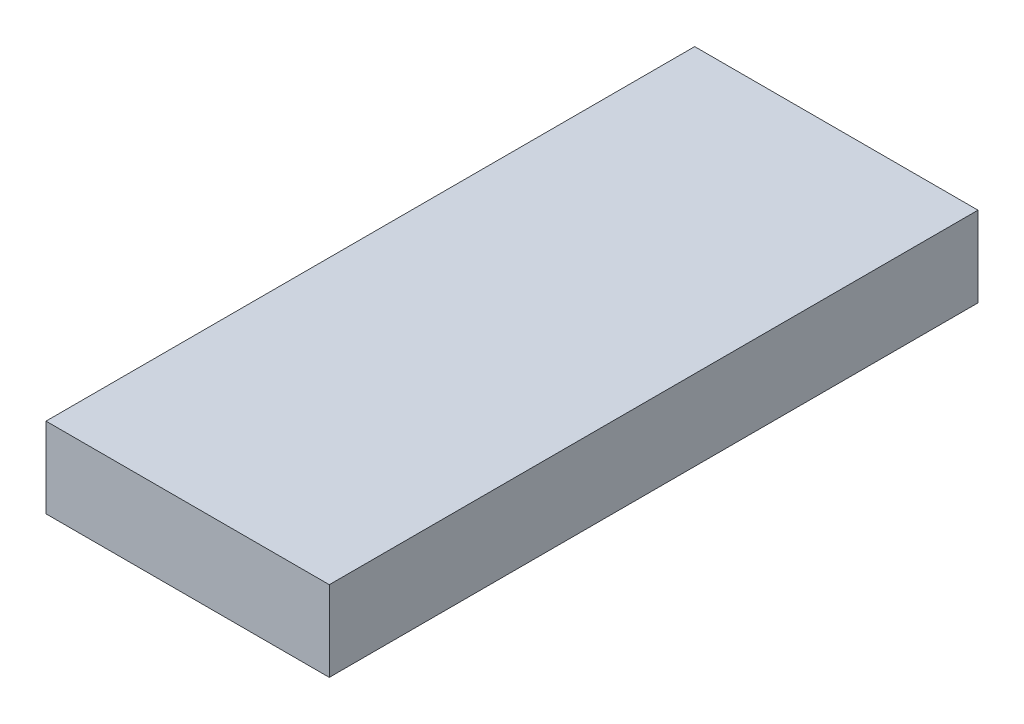
ISO-10303-21;
HEADER;
FILE_DESCRIPTION(('STEP AP214'),'2;1');
FILE_NAME('part.step','',(''),(''),'','','');
FILE_SCHEMA(('AUTOMOTIVE_DESIGN { 1 0 10303 214 1 1 1 1 }'));
ENDSEC;
DATA;
#1=APPLICATION_CONTEXT('core data for automotive mechanical design processes');
#2=APPLICATION_PROTOCOL_DEFINITION('international standard','automotive_design',2000,#1);
#3=PRODUCT_CONTEXT('',#1,'mechanical');
#4=PRODUCT('Part','Part','',(#3));
#5=PRODUCT_RELATED_PRODUCT_CATEGORY('part','',(#4));
#6=PRODUCT_DEFINITION_FORMATION('','',#4);
#7=PRODUCT_DEFINITION_CONTEXT('part definition',#1,'design');
#8=PRODUCT_DEFINITION('design','',#6,#7);
#9=PRODUCT_DEFINITION_SHAPE('','',#8);
#10=(LENGTH_UNIT() NAMED_UNIT(*) SI_UNIT(.MILLI.,.METRE.));
#11=(NAMED_UNIT(*) PLANE_ANGLE_UNIT() SI_UNIT($,.RADIAN.));
#12=(NAMED_UNIT(*) SI_UNIT($,.STERADIAN.) SOLID_ANGLE_UNIT());
#13=UNCERTAINTY_MEASURE_WITH_UNIT(LENGTH_MEASURE(1.E-05),#10,'distance_accuracy_value','');
#14=(GEOMETRIC_REPRESENTATION_CONTEXT(3) GLOBAL_UNCERTAINTY_ASSIGNED_CONTEXT((#13)) GLOBAL_UNIT_ASSIGNED_CONTEXT((#10,
#11,#12)) REPRESENTATION_CONTEXT('',''));
#15=CARTESIAN_POINT('',(0.,0.,0.));
#16=DIRECTION('',(0.,0.,1.));
#17=DIRECTION('',(1.,0.,0.));
#18=AXIS2_PLACEMENT_3D('',#15,#16,#17);
#19=CARTESIAN_POINT('',(0.,0.,0.));
#20=DIRECTION('',(0.,1.,0.));
#21=DIRECTION('',(0.,0.,1.));
#22=AXIS2_PLACEMENT_3D('',#19,#20,#21);
#23=PLANE('',#22);
#24=DIRECTION('',(0.,0.,-1.));
#25=VECTOR('',#24,1.);
#26=CARTESIAN_POINT('',(31.75,0.,-72.7));
#27=LINE('',#26,#25);
#28=CARTESIAN_POINT('',(31.75,0.,72.7));
#29=VERTEX_POINT('',#28);
#30=CARTESIAN_POINT('',(31.75,0.,-72.7));
#31=VERTEX_POINT('',#30);
#32=EDGE_CURVE('E158',#29,#31,#27,.T.);
#33=ORIENTED_EDGE('',*,*,#32,.F.);
#34=DIRECTION('',(1.,0.,0.));
#35=VECTOR('',#34,1.);
#36=CARTESIAN_POINT('',(-31.75,0.,72.7));
#37=LINE('',#36,#35);
#38=CARTESIAN_POINT('',(-31.75,0.,72.7));
#39=VERTEX_POINT('',#38);
#40=EDGE_CURVE('E151',#39,#29,#37,.T.);
#41=ORIENTED_EDGE('',*,*,#40,.F.);
#42=DIRECTION('',(0.,0.,1.));
#43=VECTOR('',#42,1.);
#44=CARTESIAN_POINT('',(-31.75,0.,-72.7));
#45=LINE('',#44,#43);
#46=CARTESIAN_POINT('',(-31.75,0.,-72.7));
#47=VERTEX_POINT('',#46);
#48=EDGE_CURVE('E163',#47,#39,#45,.T.);
#49=ORIENTED_EDGE('',*,*,#48,.F.);
#50=DIRECTION('',(-1.,0.,0.));
#51=VECTOR('',#50,1.);
#52=CARTESIAN_POINT('',(-31.75,0.,-72.7));
#53=LINE('',#52,#51);
#54=EDGE_CURVE('E161',#31,#47,#53,.T.);
#55=ORIENTED_EDGE('',*,*,#54,.F.);
#56=EDGE_LOOP('',(#33,#41,#49,#55));
#57=FACE_BOUND('',#56,.T.);
#58=CARTESIAN_POINT('',(10.75,0.,-36.72));
#59=DIRECTION('',(0.,1.,0.));
#60=DIRECTION('',(0.,0.,1.));
#61=AXIS2_PLACEMENT_3D('',#58,#59,#60);
#62=CIRCLE('',#61,0.75);
#63=CARTESIAN_POINT('',(10.75,0.,-35.97));
#64=VERTEX_POINT('',#63);
#65=EDGE_CURVE('E141',#64,#64,#62,.F.);
#66=ORIENTED_EDGE('',*,*,#65,.F.);
#67=EDGE_LOOP('',(#66));
#68=FACE_BOUND('',#67,.T.);
#69=CARTESIAN_POINT('',(10.75,0.,-34.18));
#70=DIRECTION('',(0.,1.,0.));
#71=DIRECTION('',(0.,0.,1.));
#72=AXIS2_PLACEMENT_3D('',#69,#70,#71);
#73=CIRCLE('',#72,0.75);
#74=CARTESIAN_POINT('',(10.75,0.,-33.43));
#75=VERTEX_POINT('',#74);
#76=EDGE_CURVE('E175',#75,#75,#73,.F.);
#77=ORIENTED_EDGE('',*,*,#76,.F.);
#78=EDGE_LOOP('',(#77));
#79=FACE_BOUND('',#78,.T.);
#80=CARTESIAN_POINT('',(10.75,0.,-31.64));
#81=DIRECTION('',(0.,1.,0.));
#82=DIRECTION('',(0.,0.,1.));
#83=AXIS2_PLACEMENT_3D('',#80,#81,#82);
#84=CIRCLE('',#83,0.75);
#85=CARTESIAN_POINT('',(10.75,0.,-30.89));
#86=VERTEX_POINT('',#85);
#87=EDGE_CURVE('E177',#86,#86,#84,.F.);
#88=ORIENTED_EDGE('',*,*,#87,.F.);
#89=EDGE_LOOP('',(#88));
#90=FACE_BOUND('',#89,.T.);
#91=CARTESIAN_POINT('',(10.75,0.,-29.1));
#92=DIRECTION('',(0.,1.,0.));
#93=DIRECTION('',(0.,0.,1.));
#94=AXIS2_PLACEMENT_3D('',#91,#92,#93);
#95=CIRCLE('',#94,0.75);
#96=CARTESIAN_POINT('',(10.75,0.,-28.35));
#97=VERTEX_POINT('',#96);
#98=EDGE_CURVE('E45',#97,#97,#95,.F.);
#99=ORIENTED_EDGE('',*,*,#98,.F.);
#100=EDGE_LOOP('',(#99));
#101=FACE_BOUND('',#100,.T.);
#102=DIRECTION('',(0.,0.,1.));
#103=VECTOR('',#102,1.);
#104=CARTESIAN_POINT('',(0.649999999999991,0.,-57.4));
#105=LINE('',#104,#103);
#106=CARTESIAN_POINT('',(0.649999999999991,0.,-63.1));
#107=VERTEX_POINT('',#106);
#108=CARTESIAN_POINT('',(0.649999999999991,0.,-57.4));
#109=VERTEX_POINT('',#108);
#110=EDGE_CURVE('E128',#107,#109,#105,.T.);
#111=ORIENTED_EDGE('',*,*,#110,.F.);
#112=DIRECTION('',(1.,0.,0.));
#113=VECTOR('',#112,1.);
#114=CARTESIAN_POINT('',(-14.35,0.,-63.1));
#115=LINE('',#114,#113);
#116=CARTESIAN_POINT('',(-14.35,0.,-63.1));
#117=VERTEX_POINT('',#116);
#118=EDGE_CURVE('E125',#117,#107,#115,.T.);
#119=ORIENTED_EDGE('',*,*,#118,.F.);
#120=DIRECTION('',(0.,0.,-1.));
#121=VECTOR('',#120,1.);
#122=CARTESIAN_POINT('',(-14.35,0.,-57.4));
#123=LINE('',#122,#121);
#124=CARTESIAN_POINT('',(-14.35,0.,-57.4));
#125=VERTEX_POINT('',#124);
#126=EDGE_CURVE('E63',#125,#117,#123,.T.);
#127=ORIENTED_EDGE('',*,*,#126,.F.);
#128=DIRECTION('',(-1.,0.,0.));
#129=VECTOR('',#128,1.);
#130=CARTESIAN_POINT('',(-14.35,0.,-57.4));
#131=LINE('',#130,#129);
#132=EDGE_CURVE('E58',#109,#125,#131,.T.);
#133=ORIENTED_EDGE('',*,*,#132,.F.);
#134=EDGE_LOOP('',(#111,#119,#127,#133));
#135=FACE_BOUND('',#134,.T.);
#136=ADVANCED_FACE('F41',(#57,#68,#79,#90,#101,#135),#23,.F.);
#137=CARTESIAN_POINT('',(31.75,18.,-72.7));
#138=DIRECTION('',(-1.,0.,0.));
#139=DIRECTION('',(0.,0.,1.));
#140=AXIS2_PLACEMENT_3D('',#137,#138,#139);
#141=PLANE('',#140);
#142=ORIENTED_EDGE('',*,*,#32,.T.);
#143=DIRECTION('',(0.,-1.,0.));
#144=VECTOR('',#143,1.);
#145=CARTESIAN_POINT('',(31.75,18.,-72.7));
#146=LINE('',#145,#144);
#147=CARTESIAN_POINT('',(31.75,18.,-72.7));
#148=VERTEX_POINT('',#147);
#149=EDGE_CURVE('E11',#148,#31,#146,.T.);
#150=ORIENTED_EDGE('',*,*,#149,.F.);
#151=DIRECTION('',(0.,0.,-1.));
#152=VECTOR('',#151,1.);
#153=CARTESIAN_POINT('',(31.75,18.,-72.7));
#154=LINE('',#153,#152);
#155=CARTESIAN_POINT('',(31.75,18.,72.7));
#156=VERTEX_POINT('',#155);
#157=EDGE_CURVE('E147',#156,#148,#154,.T.);
#158=ORIENTED_EDGE('',*,*,#157,.F.);
#159=DIRECTION('',(0.,-1.,0.));
#160=VECTOR('',#159,1.);
#161=CARTESIAN_POINT('',(31.75,18.,72.7));
#162=LINE('',#161,#160);
#163=EDGE_CURVE('E157',#156,#29,#162,.T.);
#164=ORIENTED_EDGE('',*,*,#163,.T.);
#165=EDGE_LOOP('',(#142,#150,#158,#164));
#166=FACE_BOUND('',#165,.T.);
#167=ADVANCED_FACE('F43',(#166),#141,.F.);
#168=CARTESIAN_POINT('',(-31.75,18.,-72.7));
#169=DIRECTION('',(0.,0.,1.));
#170=DIRECTION('',(1.,0.,0.));
#171=AXIS2_PLACEMENT_3D('',#168,#169,#170);
#172=PLANE('',#171);
#173=ORIENTED_EDGE('',*,*,#54,.T.);
#174=DIRECTION('',(0.,-1.,0.));
#175=VECTOR('',#174,1.);
#176=CARTESIAN_POINT('',(-31.75,18.,-72.7));
#177=LINE('',#176,#175);
#178=CARTESIAN_POINT('',(-31.75,18.,-72.7));
#179=VERTEX_POINT('',#178);
#180=EDGE_CURVE('E50',#179,#47,#177,.T.);
#181=ORIENTED_EDGE('',*,*,#180,.F.);
#182=DIRECTION('',(-1.,0.,0.));
#183=VECTOR('',#182,1.);
#184=CARTESIAN_POINT('',(-31.75,18.,-72.7));
#185=LINE('',#184,#183);
#186=EDGE_CURVE('E150',#148,#179,#185,.T.);
#187=ORIENTED_EDGE('',*,*,#186,.F.);
#188=ORIENTED_EDGE('',*,*,#149,.T.);
#189=EDGE_LOOP('',(#173,#181,#187,#188));
#190=FACE_BOUND('',#189,.T.);
#191=ADVANCED_FACE('F257',(#190),#172,.F.);
#192=CARTESIAN_POINT('',(-31.75,18.,-72.7));
#193=DIRECTION('',(1.,0.,0.));
#194=DIRECTION('',(0.,0.,-1.));
#195=AXIS2_PLACEMENT_3D('',#192,#193,#194);
#196=PLANE('',#195);
#197=ORIENTED_EDGE('',*,*,#48,.T.);
#198=DIRECTION('',(0.,-1.,0.));
#199=VECTOR('',#198,1.);
#200=CARTESIAN_POINT('',(-31.75,18.,72.7));
#201=LINE('',#200,#199);
#202=CARTESIAN_POINT('',(-31.75,18.,72.7));
#203=VERTEX_POINT('',#202);
#204=EDGE_CURVE('E168',#203,#39,#201,.T.);
#205=ORIENTED_EDGE('',*,*,#204,.F.);
#206=DIRECTION('',(0.,0.,1.));
#207=VECTOR('',#206,1.);
#208=CARTESIAN_POINT('',(-31.75,18.,-72.7));
#209=LINE('',#208,#207);
#210=EDGE_CURVE('E153',#179,#203,#209,.T.);
#211=ORIENTED_EDGE('',*,*,#210,.F.);
#212=ORIENTED_EDGE('',*,*,#180,.T.);
#213=EDGE_LOOP('',(#197,#205,#211,#212));
#214=FACE_BOUND('',#213,.T.);
#215=ADVANCED_FACE('F254',(#214),#196,.F.);
#216=CARTESIAN_POINT('',(-31.75,18.,72.7));
#217=DIRECTION('',(0.,0.,-1.));
#218=DIRECTION('',(-1.,0.,0.));
#219=AXIS2_PLACEMENT_3D('',#216,#217,#218);
#220=PLANE('',#219);
#221=ORIENTED_EDGE('',*,*,#40,.T.);
#222=ORIENTED_EDGE('',*,*,#163,.F.);
#223=DIRECTION('',(1.,0.,0.));
#224=VECTOR('',#223,1.);
#225=CARTESIAN_POINT('',(-31.75,18.,72.7));
#226=LINE('',#225,#224);
#227=EDGE_CURVE('E155',#203,#156,#226,.T.);
#228=ORIENTED_EDGE('',*,*,#227,.F.);
#229=ORIENTED_EDGE('',*,*,#204,.T.);
#230=EDGE_LOOP('',(#221,#222,#228,#229));
#231=FACE_BOUND('',#230,.T.);
#232=ADVANCED_FACE('F249',(#231),#220,.F.);
#233=CARTESIAN_POINT('',(0.,18.,0.));
#234=DIRECTION('',(0.,1.,0.));
#235=DIRECTION('',(0.,0.,1.));
#236=AXIS2_PLACEMENT_3D('',#233,#234,#235);
#237=PLANE('',#236);
#238=ORIENTED_EDGE('',*,*,#157,.T.);
#239=ORIENTED_EDGE('',*,*,#186,.T.);
#240=ORIENTED_EDGE('',*,*,#210,.T.);
#241=ORIENTED_EDGE('',*,*,#227,.T.);
#242=EDGE_LOOP('',(#238,#239,#240,#241));
#243=FACE_BOUND('',#242,.T.);
#244=ADVANCED_FACE('F243',(#243),#237,.T.);
#245=CARTESIAN_POINT('',(10.75,-1.2E-05,-36.72));
#246=DIRECTION('',(0.,1.,0.));
#247=DIRECTION('',(0.,0.,1.));
#248=AXIS2_PLACEMENT_3D('',#245,#246,#247);
#249=CYLINDRICAL_SURFACE('',#248,0.75);
#250=CARTESIAN_POINT('',(10.75,8.,-36.72));
#251=DIRECTION('',(0.,-1.,0.));
#252=DIRECTION('',(0.,0.,-1.));
#253=AXIS2_PLACEMENT_3D('',#250,#251,#252);
#254=CIRCLE('',#253,0.75);
#255=CARTESIAN_POINT('',(10.75,8.,-35.97));
#256=VERTEX_POINT('',#255);
#257=EDGE_CURVE('E129',#256,#256,#254,.T.);
#258=CARTESIAN_POINT('',(10.75,8.,-35.97));
#259=CARTESIAN_POINT('',(10.75,7.91666666666667,-35.97));
#260=CARTESIAN_POINT('',(10.75,7.83333333333334,-35.97));
#261=CARTESIAN_POINT('',(10.75,7.66666666666667,-35.97));
#262=CARTESIAN_POINT('',(10.75,7.58333333333334,-35.97));
#263=CARTESIAN_POINT('',(10.75,7.41666666666667,-35.97));
#264=CARTESIAN_POINT('',(10.75,7.33333333333334,-35.97));
#265=CARTESIAN_POINT('',(10.75,7.16666666666667,-35.97));
#266=CARTESIAN_POINT('',(10.75,7.08333333333334,-35.97));
#267=CARTESIAN_POINT('',(10.75,6.91666666666667,-35.97));
#268=CARTESIAN_POINT('',(10.75,6.83333333333334,-35.97));
#269=CARTESIAN_POINT('',(10.75,6.66666666666667,-35.97));
#270=CARTESIAN_POINT('',(10.75,6.58333333333334,-35.97));
#271=CARTESIAN_POINT('',(10.75,6.41666666666667,-35.97));
#272=CARTESIAN_POINT('',(10.75,6.33333333333334,-35.97));
#273=CARTESIAN_POINT('',(10.75,6.16666666666667,-35.97));
#274=CARTESIAN_POINT('',(10.75,6.08333333333334,-35.97));
#275=CARTESIAN_POINT('',(10.75,5.91666666666667,-35.97));
#276=CARTESIAN_POINT('',(10.75,5.83333333333334,-35.97));
#277=CARTESIAN_POINT('',(10.75,5.66666666666667,-35.97));
#278=CARTESIAN_POINT('',(10.75,5.58333333333334,-35.97));
#279=CARTESIAN_POINT('',(10.75,5.41666666666667,-35.97));
#280=CARTESIAN_POINT('',(10.75,5.33333333333334,-35.97));
#281=CARTESIAN_POINT('',(10.75,5.16666666666667,-35.97));
#282=CARTESIAN_POINT('',(10.75,5.08333333333334,-35.97));
#283=CARTESIAN_POINT('',(10.75,4.91666666666667,-35.97));
#284=CARTESIAN_POINT('',(10.75,4.83333333333334,-35.97));
#285=CARTESIAN_POINT('',(10.75,4.66666666666667,-35.97));
#286=CARTESIAN_POINT('',(10.75,4.58333333333334,-35.97));
#287=CARTESIAN_POINT('',(10.75,4.41666666666667,-35.97));
#288=CARTESIAN_POINT('',(10.75,4.33333333333334,-35.97));
#289=CARTESIAN_POINT('',(10.75,4.16666666666667,-35.97));
#290=CARTESIAN_POINT('',(10.75,4.08333333333334,-35.97));
#291=CARTESIAN_POINT('',(10.75,3.91666666666667,-35.97));
#292=CARTESIAN_POINT('',(10.75,3.83333333333333,-35.97));
#293=CARTESIAN_POINT('',(10.75,3.66666666666667,-35.97));
#294=CARTESIAN_POINT('',(10.75,3.58333333333333,-35.97));
#295=CARTESIAN_POINT('',(10.75,3.41666666666667,-35.97));
#296=CARTESIAN_POINT('',(10.75,3.33333333333333,-35.97));
#297=CARTESIAN_POINT('',(10.75,3.16666666666667,-35.97));
#298=CARTESIAN_POINT('',(10.75,3.08333333333333,-35.97));
#299=CARTESIAN_POINT('',(10.75,2.91666666666667,-35.97));
#300=CARTESIAN_POINT('',(10.75,2.83333333333333,-35.97));
#301=CARTESIAN_POINT('',(10.75,2.66666666666667,-35.97));
#302=CARTESIAN_POINT('',(10.75,2.58333333333333,-35.97));
#303=CARTESIAN_POINT('',(10.75,2.41666666666667,-35.97));
#304=CARTESIAN_POINT('',(10.75,2.33333333333333,-35.97));
#305=CARTESIAN_POINT('',(10.75,2.16666666666667,-35.97));
#306=CARTESIAN_POINT('',(10.75,2.08333333333333,-35.97));
#307=CARTESIAN_POINT('',(10.75,1.91666666666667,-35.97));
#308=CARTESIAN_POINT('',(10.75,1.83333333333333,-35.97));
#309=CARTESIAN_POINT('',(10.75,1.66666666666667,-35.97));
#310=CARTESIAN_POINT('',(10.75,1.58333333333333,-35.97));
#311=CARTESIAN_POINT('',(10.75,1.41666666666667,-35.97));
#312=CARTESIAN_POINT('',(10.75,1.33333333333333,-35.97));
#313=CARTESIAN_POINT('',(10.75,1.16666666666667,-35.97));
#314=CARTESIAN_POINT('',(10.75,1.08333333333333,-35.97));
#315=CARTESIAN_POINT('',(10.75,0.916666666666668,-35.97));
#316=CARTESIAN_POINT('',(10.75,0.833333333333335,-35.97));
#317=CARTESIAN_POINT('',(10.75,0.666666666666668,-35.97));
#318=CARTESIAN_POINT('',(10.75,0.583333333333334,-35.97));
#319=CARTESIAN_POINT('',(10.75,0.416666666666668,-35.97));
#320=CARTESIAN_POINT('',(10.75,0.333333333333334,-35.97));
#321=CARTESIAN_POINT('',(10.75,0.166666666666667,-35.97));
#322=CARTESIAN_POINT('',(10.75,0.0833333333333339,-35.97));
#323=CARTESIAN_POINT('',(10.75,0.,-35.97));
#324=B_SPLINE_CURVE_WITH_KNOTS('',3,(#258,#259,#260,#261,#262,#263,#264,#265,#266,#267,#268,
#269,#270,#271,#272,#273,#274,#275,#276,#277,#278,#279,#280,#281,#282,#283,#284,#285,#286,#287,
#288,#289,#290,#291,#292,#293,#294,#295,#296,#297,#298,#299,#300,#301,#302,#303,#304,#305,#306,
#307,#308,#309,#310,#311,#312,#313,#314,#315,#316,#317,#318,#319,#320,#321,#322,#323),
.UNSPECIFIED.,.F.,.F.,(4,2,2,2,2,2,2,2,2,2,2,2,2,2,2,2,2,2,2,2,2,2,2,2,2,2,2,2,2,2,2,2,4),(0.,
0.249999999999999,0.499999999999999,0.749999999999999,0.999999999999999,1.25,1.5,1.75,2.,2.25,
2.5,2.75,3.,3.25,3.5,3.75,4.,4.25,4.5,4.75,5.,5.25,5.5,5.75,6.,6.25,6.5,6.75,7.,7.25,7.5,7.75,
8.),.UNSPECIFIED.);
#325=EDGE_CURVE('BSEAM240',#256,#64,#324,.T.);
#326=ORIENTED_EDGE('',*,*,#257,.F.);
#327=ORIENTED_EDGE('',*,*,#65,.T.);
#328=ORIENTED_EDGE('',*,*,#325,.T.);
#329=ORIENTED_EDGE('',*,*,#325,.F.);
#330=EDGE_LOOP('',(#326,#328,#327,#329));
#331=FACE_BOUND('',#330,.T.);
#332=ADVANCED_FACE('F240',(#331),#249,.F.);
#333=CARTESIAN_POINT('',(10.75,8.,-36.72));
#334=DIRECTION('',(0.,-1.,0.));
#335=DIRECTION('',(0.,0.,-1.));
#336=AXIS2_PLACEMENT_3D('',#333,#334,#335);
#337=PLANE('',#336);
#338=ORIENTED_EDGE('',*,*,#257,.T.);
#339=EDGE_LOOP('',(#338));
#340=FACE_BOUND('',#339,.T.);
#341=ADVANCED_FACE('F235',(#340),#337,.T.);
#342=CARTESIAN_POINT('',(10.75,-1.2E-05,-34.18));
#343=DIRECTION('',(0.,1.,0.));
#344=DIRECTION('',(0.,0.,1.));
#345=AXIS2_PLACEMENT_3D('',#342,#343,#344);
#346=CYLINDRICAL_SURFACE('',#345,0.75);
#347=CARTESIAN_POINT('',(10.75,8.,-34.18));
#348=DIRECTION('',(0.,-1.,0.));
#349=DIRECTION('',(0.,0.,-1.));
#350=AXIS2_PLACEMENT_3D('',#347,#348,#349);
#351=CIRCLE('',#350,0.75);
#352=CARTESIAN_POINT('',(10.75,8.,-33.43));
#353=VERTEX_POINT('',#352);
#354=EDGE_CURVE('E132',#353,#353,#351,.T.);
#355=CARTESIAN_POINT('',(10.75,8.,-33.43));
#356=CARTESIAN_POINT('',(10.75,7.91666666666667,-33.43));
#357=CARTESIAN_POINT('',(10.75,7.83333333333334,-33.43));
#358=CARTESIAN_POINT('',(10.75,7.66666666666667,-33.43));
#359=CARTESIAN_POINT('',(10.75,7.58333333333334,-33.43));
#360=CARTESIAN_POINT('',(10.75,7.41666666666667,-33.43));
#361=CARTESIAN_POINT('',(10.75,7.33333333333334,-33.43));
#362=CARTESIAN_POINT('',(10.75,7.16666666666667,-33.43));
#363=CARTESIAN_POINT('',(10.75,7.08333333333334,-33.43));
#364=CARTESIAN_POINT('',(10.75,6.91666666666667,-33.43));
#365=CARTESIAN_POINT('',(10.75,6.83333333333334,-33.43));
#366=CARTESIAN_POINT('',(10.75,6.66666666666667,-33.43));
#367=CARTESIAN_POINT('',(10.75,6.58333333333334,-33.43));
#368=CARTESIAN_POINT('',(10.75,6.41666666666667,-33.43));
#369=CARTESIAN_POINT('',(10.75,6.33333333333334,-33.43));
#370=CARTESIAN_POINT('',(10.75,6.16666666666667,-33.43));
#371=CARTESIAN_POINT('',(10.75,6.08333333333334,-33.43));
#372=CARTESIAN_POINT('',(10.75,5.91666666666667,-33.43));
#373=CARTESIAN_POINT('',(10.75,5.83333333333334,-33.43));
#374=CARTESIAN_POINT('',(10.75,5.66666666666667,-33.43));
#375=CARTESIAN_POINT('',(10.75,5.58333333333334,-33.43));
#376=CARTESIAN_POINT('',(10.75,5.41666666666667,-33.43));
#377=CARTESIAN_POINT('',(10.75,5.33333333333334,-33.43));
#378=CARTESIAN_POINT('',(10.75,5.16666666666667,-33.43));
#379=CARTESIAN_POINT('',(10.75,5.08333333333334,-33.43));
#380=CARTESIAN_POINT('',(10.75,4.91666666666667,-33.43));
#381=CARTESIAN_POINT('',(10.75,4.83333333333334,-33.43));
#382=CARTESIAN_POINT('',(10.75,4.66666666666667,-33.43));
#383=CARTESIAN_POINT('',(10.75,4.58333333333334,-33.43));
#384=CARTESIAN_POINT('',(10.75,4.41666666666667,-33.43));
#385=CARTESIAN_POINT('',(10.75,4.33333333333334,-33.43));
#386=CARTESIAN_POINT('',(10.75,4.16666666666667,-33.43));
#387=CARTESIAN_POINT('',(10.75,4.08333333333334,-33.43));
#388=CARTESIAN_POINT('',(10.75,3.91666666666667,-33.43));
#389=CARTESIAN_POINT('',(10.75,3.83333333333333,-33.43));
#390=CARTESIAN_POINT('',(10.75,3.66666666666667,-33.43));
#391=CARTESIAN_POINT('',(10.75,3.58333333333333,-33.43));
#392=CARTESIAN_POINT('',(10.75,3.41666666666667,-33.43));
#393=CARTESIAN_POINT('',(10.75,3.33333333333333,-33.43));
#394=CARTESIAN_POINT('',(10.75,3.16666666666667,-33.43));
#395=CARTESIAN_POINT('',(10.75,3.08333333333333,-33.43));
#396=CARTESIAN_POINT('',(10.75,2.91666666666667,-33.43));
#397=CARTESIAN_POINT('',(10.75,2.83333333333333,-33.43));
#398=CARTESIAN_POINT('',(10.75,2.66666666666667,-33.43));
#399=CARTESIAN_POINT('',(10.75,2.58333333333333,-33.43));
#400=CARTESIAN_POINT('',(10.75,2.41666666666667,-33.43));
#401=CARTESIAN_POINT('',(10.75,2.33333333333333,-33.43));
#402=CARTESIAN_POINT('',(10.75,2.16666666666667,-33.43));
#403=CARTESIAN_POINT('',(10.75,2.08333333333333,-33.43));
#404=CARTESIAN_POINT('',(10.75,1.91666666666667,-33.43));
#405=CARTESIAN_POINT('',(10.75,1.83333333333333,-33.43));
#406=CARTESIAN_POINT('',(10.75,1.66666666666667,-33.43));
#407=CARTESIAN_POINT('',(10.75,1.58333333333333,-33.43));
#408=CARTESIAN_POINT('',(10.75,1.41666666666667,-33.43));
#409=CARTESIAN_POINT('',(10.75,1.33333333333333,-33.43));
#410=CARTESIAN_POINT('',(10.75,1.16666666666667,-33.43));
#411=CARTESIAN_POINT('',(10.75,1.08333333333333,-33.43));
#412=CARTESIAN_POINT('',(10.75,0.916666666666668,-33.43));
#413=CARTESIAN_POINT('',(10.75,0.833333333333335,-33.43));
#414=CARTESIAN_POINT('',(10.75,0.666666666666668,-33.43));
#415=CARTESIAN_POINT('',(10.75,0.583333333333334,-33.43));
#416=CARTESIAN_POINT('',(10.75,0.416666666666668,-33.43));
#417=CARTESIAN_POINT('',(10.75,0.333333333333334,-33.43));
#418=CARTESIAN_POINT('',(10.75,0.166666666666667,-33.43));
#419=CARTESIAN_POINT('',(10.75,0.0833333333333339,-33.43));
#420=CARTESIAN_POINT('',(10.75,0.,-33.43));
#421=B_SPLINE_CURVE_WITH_KNOTS('',3,(#355,#356,#357,#358,#359,#360,#361,#362,#363,#364,#365,
#366,#367,#368,#369,#370,#371,#372,#373,#374,#375,#376,#377,#378,#379,#380,#381,#382,#383,#384,
#385,#386,#387,#388,#389,#390,#391,#392,#393,#394,#395,#396,#397,#398,#399,#400,#401,#402,#403,
#404,#405,#406,#407,#408,#409,#410,#411,#412,#413,#414,#415,#416,#417,#418,#419,#420),
.UNSPECIFIED.,.F.,.F.,(4,2,2,2,2,2,2,2,2,2,2,2,2,2,2,2,2,2,2,2,2,2,2,2,2,2,2,2,2,2,2,2,4),(0.,
0.249999999999999,0.499999999999999,0.749999999999999,0.999999999999999,1.25,1.5,1.75,2.,2.25,
2.5,2.75,3.,3.25,3.5,3.75,4.,4.25,4.5,4.75,5.,5.25,5.5,5.75,6.,6.25,6.5,6.75,7.,7.25,7.5,7.75,
8.),.UNSPECIFIED.);
#422=EDGE_CURVE('BSEAM232',#353,#75,#421,.T.);
#423=ORIENTED_EDGE('',*,*,#354,.F.);
#424=ORIENTED_EDGE('',*,*,#76,.T.);
#425=ORIENTED_EDGE('',*,*,#422,.T.);
#426=ORIENTED_EDGE('',*,*,#422,.F.);
#427=EDGE_LOOP('',(#423,#425,#424,#426));
#428=FACE_BOUND('',#427,.T.);
#429=ADVANCED_FACE('F232',(#428),#346,.F.);
#430=CARTESIAN_POINT('',(10.75,8.,-34.18));
#431=DIRECTION('',(0.,-1.,0.));
#432=DIRECTION('',(0.,0.,-1.));
#433=AXIS2_PLACEMENT_3D('',#430,#431,#432);
#434=PLANE('',#433);
#435=ORIENTED_EDGE('',*,*,#354,.T.);
#436=EDGE_LOOP('',(#435));
#437=FACE_BOUND('',#436,.T.);
#438=ADVANCED_FACE('F227',(#437),#434,.T.);
#439=CARTESIAN_POINT('',(10.75,-1.2E-05,-31.64));
#440=DIRECTION('',(0.,1.,0.));
#441=DIRECTION('',(0.,0.,1.));
#442=AXIS2_PLACEMENT_3D('',#439,#440,#441);
#443=CYLINDRICAL_SURFACE('',#442,0.75);
#444=CARTESIAN_POINT('',(10.75,8.,-31.64));
#445=DIRECTION('',(0.,-1.,0.));
#446=DIRECTION('',(0.,0.,-1.));
#447=AXIS2_PLACEMENT_3D('',#444,#445,#446);
#448=CIRCLE('',#447,0.75);
#449=CARTESIAN_POINT('',(10.75,8.,-30.89));
#450=VERTEX_POINT('',#449);
#451=EDGE_CURVE('E142',#450,#450,#448,.T.);
#452=CARTESIAN_POINT('',(10.75,8.,-30.89));
#453=CARTESIAN_POINT('',(10.75,7.91666666666667,-30.89));
#454=CARTESIAN_POINT('',(10.75,7.83333333333334,-30.89));
#455=CARTESIAN_POINT('',(10.75,7.66666666666667,-30.89));
#456=CARTESIAN_POINT('',(10.75,7.58333333333334,-30.89));
#457=CARTESIAN_POINT('',(10.75,7.41666666666667,-30.89));
#458=CARTESIAN_POINT('',(10.75,7.33333333333334,-30.89));
#459=CARTESIAN_POINT('',(10.75,7.16666666666667,-30.89));
#460=CARTESIAN_POINT('',(10.75,7.08333333333334,-30.89));
#461=CARTESIAN_POINT('',(10.75,6.91666666666667,-30.89));
#462=CARTESIAN_POINT('',(10.75,6.83333333333334,-30.89));
#463=CARTESIAN_POINT('',(10.75,6.66666666666667,-30.89));
#464=CARTESIAN_POINT('',(10.75,6.58333333333334,-30.89));
#465=CARTESIAN_POINT('',(10.75,6.41666666666667,-30.89));
#466=CARTESIAN_POINT('',(10.75,6.33333333333334,-30.89));
#467=CARTESIAN_POINT('',(10.75,6.16666666666667,-30.89));
#468=CARTESIAN_POINT('',(10.75,6.08333333333334,-30.89));
#469=CARTESIAN_POINT('',(10.75,5.91666666666667,-30.89));
#470=CARTESIAN_POINT('',(10.75,5.83333333333334,-30.89));
#471=CARTESIAN_POINT('',(10.75,5.66666666666667,-30.89));
#472=CARTESIAN_POINT('',(10.75,5.58333333333334,-30.89));
#473=CARTESIAN_POINT('',(10.75,5.41666666666667,-30.89));
#474=CARTESIAN_POINT('',(10.75,5.33333333333334,-30.89));
#475=CARTESIAN_POINT('',(10.75,5.16666666666667,-30.89));
#476=CARTESIAN_POINT('',(10.75,5.08333333333334,-30.89));
#477=CARTESIAN_POINT('',(10.75,4.91666666666667,-30.89));
#478=CARTESIAN_POINT('',(10.75,4.83333333333334,-30.89));
#479=CARTESIAN_POINT('',(10.75,4.66666666666667,-30.89));
#480=CARTESIAN_POINT('',(10.75,4.58333333333334,-30.89));
#481=CARTESIAN_POINT('',(10.75,4.41666666666667,-30.89));
#482=CARTESIAN_POINT('',(10.75,4.33333333333334,-30.89));
#483=CARTESIAN_POINT('',(10.75,4.16666666666667,-30.89));
#484=CARTESIAN_POINT('',(10.75,4.08333333333334,-30.89));
#485=CARTESIAN_POINT('',(10.75,3.91666666666667,-30.89));
#486=CARTESIAN_POINT('',(10.75,3.83333333333333,-30.89));
#487=CARTESIAN_POINT('',(10.75,3.66666666666667,-30.89));
#488=CARTESIAN_POINT('',(10.75,3.58333333333333,-30.89));
#489=CARTESIAN_POINT('',(10.75,3.41666666666667,-30.89));
#490=CARTESIAN_POINT('',(10.75,3.33333333333333,-30.89));
#491=CARTESIAN_POINT('',(10.75,3.16666666666667,-30.89));
#492=CARTESIAN_POINT('',(10.75,3.08333333333333,-30.89));
#493=CARTESIAN_POINT('',(10.75,2.91666666666667,-30.89));
#494=CARTESIAN_POINT('',(10.75,2.83333333333333,-30.89));
#495=CARTESIAN_POINT('',(10.75,2.66666666666667,-30.89));
#496=CARTESIAN_POINT('',(10.75,2.58333333333333,-30.89));
#497=CARTESIAN_POINT('',(10.75,2.41666666666667,-30.89));
#498=CARTESIAN_POINT('',(10.75,2.33333333333333,-30.89));
#499=CARTESIAN_POINT('',(10.75,2.16666666666667,-30.89));
#500=CARTESIAN_POINT('',(10.75,2.08333333333333,-30.89));
#501=CARTESIAN_POINT('',(10.75,1.91666666666667,-30.89));
#502=CARTESIAN_POINT('',(10.75,1.83333333333333,-30.89));
#503=CARTESIAN_POINT('',(10.75,1.66666666666667,-30.89));
#504=CARTESIAN_POINT('',(10.75,1.58333333333333,-30.89));
#505=CARTESIAN_POINT('',(10.75,1.41666666666667,-30.89));
#506=CARTESIAN_POINT('',(10.75,1.33333333333333,-30.89));
#507=CARTESIAN_POINT('',(10.75,1.16666666666667,-30.89));
#508=CARTESIAN_POINT('',(10.75,1.08333333333333,-30.89));
#509=CARTESIAN_POINT('',(10.75,0.916666666666668,-30.89));
#510=CARTESIAN_POINT('',(10.75,0.833333333333335,-30.89));
#511=CARTESIAN_POINT('',(10.75,0.666666666666668,-30.89));
#512=CARTESIAN_POINT('',(10.75,0.583333333333334,-30.89));
#513=CARTESIAN_POINT('',(10.75,0.416666666666668,-30.89));
#514=CARTESIAN_POINT('',(10.75,0.333333333333334,-30.89));
#515=CARTESIAN_POINT('',(10.75,0.166666666666667,-30.89));
#516=CARTESIAN_POINT('',(10.75,0.0833333333333339,-30.89));
#517=CARTESIAN_POINT('',(10.75,0.,-30.89));
#518=B_SPLINE_CURVE_WITH_KNOTS('',3,(#452,#453,#454,#455,#456,#457,#458,#459,#460,#461,#462,
#463,#464,#465,#466,#467,#468,#469,#470,#471,#472,#473,#474,#475,#476,#477,#478,#479,#480,#481,
#482,#483,#484,#485,#486,#487,#488,#489,#490,#491,#492,#493,#494,#495,#496,#497,#498,#499,#500,
#501,#502,#503,#504,#505,#506,#507,#508,#509,#510,#511,#512,#513,#514,#515,#516,#517),
.UNSPECIFIED.,.F.,.F.,(4,2,2,2,2,2,2,2,2,2,2,2,2,2,2,2,2,2,2,2,2,2,2,2,2,2,2,2,2,2,2,2,4),(0.,
0.249999999999999,0.499999999999999,0.749999999999999,0.999999999999999,1.25,1.5,1.75,2.,2.25,
2.5,2.75,3.,3.25,3.5,3.75,4.,4.25,4.5,4.75,5.,5.25,5.5,5.75,6.,6.25,6.5,6.75,7.,7.25,7.5,7.75,
8.),.UNSPECIFIED.);
#519=EDGE_CURVE('BSEAM224',#450,#86,#518,.T.);
#520=ORIENTED_EDGE('',*,*,#451,.F.);
#521=ORIENTED_EDGE('',*,*,#87,.T.);
#522=ORIENTED_EDGE('',*,*,#519,.T.);
#523=ORIENTED_EDGE('',*,*,#519,.F.);
#524=EDGE_LOOP('',(#520,#522,#521,#523));
#525=FACE_BOUND('',#524,.T.);
#526=ADVANCED_FACE('F224',(#525),#443,.F.);
#527=CARTESIAN_POINT('',(10.75,8.,-31.64));
#528=DIRECTION('',(0.,-1.,0.));
#529=DIRECTION('',(0.,0.,-1.));
#530=AXIS2_PLACEMENT_3D('',#527,#528,#529);
#531=PLANE('',#530);
#532=ORIENTED_EDGE('',*,*,#451,.T.);
#533=EDGE_LOOP('',(#532));
#534=FACE_BOUND('',#533,.T.);
#535=ADVANCED_FACE('F222',(#534),#531,.T.);
#536=CARTESIAN_POINT('',(10.75,-1.2E-05,-29.1));
#537=DIRECTION('',(0.,1.,0.));
#538=DIRECTION('',(0.,0.,1.));
#539=AXIS2_PLACEMENT_3D('',#536,#537,#538);
#540=CYLINDRICAL_SURFACE('',#539,0.75);
#541=CARTESIAN_POINT('',(10.75,8.,-29.1));
#542=DIRECTION('',(0.,-1.,0.));
#543=DIRECTION('',(0.,0.,-1.));
#544=AXIS2_PLACEMENT_3D('',#541,#542,#543);
#545=CIRCLE('',#544,0.75);
#546=CARTESIAN_POINT('',(10.75,8.,-28.35));
#547=VERTEX_POINT('',#546);
#548=EDGE_CURVE('E138',#547,#547,#545,.T.);
#549=CARTESIAN_POINT('',(10.75,8.,-28.35));
#550=CARTESIAN_POINT('',(10.75,7.91666666666667,-28.35));
#551=CARTESIAN_POINT('',(10.75,7.83333333333334,-28.35));
#552=CARTESIAN_POINT('',(10.75,7.66666666666667,-28.35));
#553=CARTESIAN_POINT('',(10.75,7.58333333333334,-28.35));
#554=CARTESIAN_POINT('',(10.75,7.41666666666667,-28.35));
#555=CARTESIAN_POINT('',(10.75,7.33333333333334,-28.35));
#556=CARTESIAN_POINT('',(10.75,7.16666666666667,-28.35));
#557=CARTESIAN_POINT('',(10.75,7.08333333333334,-28.35));
#558=CARTESIAN_POINT('',(10.75,6.91666666666667,-28.35));
#559=CARTESIAN_POINT('',(10.75,6.83333333333334,-28.35));
#560=CARTESIAN_POINT('',(10.75,6.66666666666667,-28.35));
#561=CARTESIAN_POINT('',(10.75,6.58333333333334,-28.35));
#562=CARTESIAN_POINT('',(10.75,6.41666666666667,-28.35));
#563=CARTESIAN_POINT('',(10.75,6.33333333333334,-28.35));
#564=CARTESIAN_POINT('',(10.75,6.16666666666667,-28.35));
#565=CARTESIAN_POINT('',(10.75,6.08333333333334,-28.35));
#566=CARTESIAN_POINT('',(10.75,5.91666666666667,-28.35));
#567=CARTESIAN_POINT('',(10.75,5.83333333333334,-28.35));
#568=CARTESIAN_POINT('',(10.75,5.66666666666667,-28.35));
#569=CARTESIAN_POINT('',(10.75,5.58333333333334,-28.35));
#570=CARTESIAN_POINT('',(10.75,5.41666666666667,-28.35));
#571=CARTESIAN_POINT('',(10.75,5.33333333333334,-28.35));
#572=CARTESIAN_POINT('',(10.75,5.16666666666667,-28.35));
#573=CARTESIAN_POINT('',(10.75,5.08333333333334,-28.35));
#574=CARTESIAN_POINT('',(10.75,4.91666666666667,-28.35));
#575=CARTESIAN_POINT('',(10.75,4.83333333333334,-28.35));
#576=CARTESIAN_POINT('',(10.75,4.66666666666667,-28.35));
#577=CARTESIAN_POINT('',(10.75,4.58333333333334,-28.35));
#578=CARTESIAN_POINT('',(10.75,4.41666666666667,-28.35));
#579=CARTESIAN_POINT('',(10.75,4.33333333333334,-28.35));
#580=CARTESIAN_POINT('',(10.75,4.16666666666667,-28.35));
#581=CARTESIAN_POINT('',(10.75,4.08333333333334,-28.35));
#582=CARTESIAN_POINT('',(10.75,3.91666666666667,-28.35));
#583=CARTESIAN_POINT('',(10.75,3.83333333333333,-28.35));
#584=CARTESIAN_POINT('',(10.75,3.66666666666667,-28.35));
#585=CARTESIAN_POINT('',(10.75,3.58333333333333,-28.35));
#586=CARTESIAN_POINT('',(10.75,3.41666666666667,-28.35));
#587=CARTESIAN_POINT('',(10.75,3.33333333333333,-28.35));
#588=CARTESIAN_POINT('',(10.75,3.16666666666667,-28.35));
#589=CARTESIAN_POINT('',(10.75,3.08333333333333,-28.35));
#590=CARTESIAN_POINT('',(10.75,2.91666666666667,-28.35));
#591=CARTESIAN_POINT('',(10.75,2.83333333333333,-28.35));
#592=CARTESIAN_POINT('',(10.75,2.66666666666667,-28.35));
#593=CARTESIAN_POINT('',(10.75,2.58333333333333,-28.35));
#594=CARTESIAN_POINT('',(10.75,2.41666666666667,-28.35));
#595=CARTESIAN_POINT('',(10.75,2.33333333333333,-28.35));
#596=CARTESIAN_POINT('',(10.75,2.16666666666667,-28.35));
#597=CARTESIAN_POINT('',(10.75,2.08333333333333,-28.35));
#598=CARTESIAN_POINT('',(10.75,1.91666666666667,-28.35));
#599=CARTESIAN_POINT('',(10.75,1.83333333333333,-28.35));
#600=CARTESIAN_POINT('',(10.75,1.66666666666667,-28.35));
#601=CARTESIAN_POINT('',(10.75,1.58333333333333,-28.35));
#602=CARTESIAN_POINT('',(10.75,1.41666666666667,-28.35));
#603=CARTESIAN_POINT('',(10.75,1.33333333333333,-28.35));
#604=CARTESIAN_POINT('',(10.75,1.16666666666667,-28.35));
#605=CARTESIAN_POINT('',(10.75,1.08333333333333,-28.35));
#606=CARTESIAN_POINT('',(10.75,0.916666666666668,-28.35));
#607=CARTESIAN_POINT('',(10.75,0.833333333333335,-28.35));
#608=CARTESIAN_POINT('',(10.75,0.666666666666668,-28.35));
#609=CARTESIAN_POINT('',(10.75,0.583333333333334,-28.35));
#610=CARTESIAN_POINT('',(10.75,0.416666666666668,-28.35));
#611=CARTESIAN_POINT('',(10.75,0.333333333333334,-28.35));
#612=CARTESIAN_POINT('',(10.75,0.166666666666667,-28.35));
#613=CARTESIAN_POINT('',(10.75,0.0833333333333339,-28.35));
#614=CARTESIAN_POINT('',(10.75,0.,-28.35));
#615=B_SPLINE_CURVE_WITH_KNOTS('',3,(#549,#550,#551,#552,#553,#554,#555,#556,#557,#558,#559,
#560,#561,#562,#563,#564,#565,#566,#567,#568,#569,#570,#571,#572,#573,#574,#575,#576,#577,#578,
#579,#580,#581,#582,#583,#584,#585,#586,#587,#588,#589,#590,#591,#592,#593,#594,#595,#596,#597,
#598,#599,#600,#601,#602,#603,#604,#605,#606,#607,#608,#609,#610,#611,#612,#613,#614),
.UNSPECIFIED.,.F.,.F.,(4,2,2,2,2,2,2,2,2,2,2,2,2,2,2,2,2,2,2,2,2,2,2,2,2,2,2,2,2,2,2,2,4),(0.,
0.249999999999999,0.499999999999999,0.749999999999999,0.999999999999999,1.25,1.5,1.75,2.,2.25,
2.5,2.75,3.,3.25,3.5,3.75,4.,4.25,4.5,4.75,5.,5.25,5.5,5.75,6.,6.25,6.5,6.75,7.,7.25,7.5,7.75,
8.),.UNSPECIFIED.);
#616=EDGE_CURVE('BSEAM184',#547,#97,#615,.T.);
#617=ORIENTED_EDGE('',*,*,#548,.F.);
#618=ORIENTED_EDGE('',*,*,#98,.T.);
#619=ORIENTED_EDGE('',*,*,#616,.T.);
#620=ORIENTED_EDGE('',*,*,#616,.F.);
#621=EDGE_LOOP('',(#617,#619,#618,#620));
#622=FACE_BOUND('',#621,.T.);
#623=ADVANCED_FACE('F184',(#622),#540,.F.);
#624=CARTESIAN_POINT('',(10.75,8.,-29.1));
#625=DIRECTION('',(0.,-1.,0.));
#626=DIRECTION('',(0.,0.,-1.));
#627=AXIS2_PLACEMENT_3D('',#624,#625,#626);
#628=PLANE('',#627);
#629=ORIENTED_EDGE('',*,*,#548,.T.);
#630=EDGE_LOOP('',(#629));
#631=FACE_BOUND('',#630,.T.);
#632=ADVANCED_FACE('F216',(#631),#628,.T.);
#633=CARTESIAN_POINT('',(0.649999999999991,-1.,-57.4));
#634=DIRECTION('',(-1.,0.,0.));
#635=DIRECTION('',(0.,0.,1.));
#636=AXIS2_PLACEMENT_3D('',#633,#634,#635);
#637=PLANE('',#636);
#638=ORIENTED_EDGE('',*,*,#110,.T.);
#639=DIRECTION('',(0.,1.,0.));
#640=VECTOR('',#639,1.);
#641=CARTESIAN_POINT('',(0.649999999999991,-1.,-57.4));
#642=LINE('',#641,#640);
#643=CARTESIAN_POINT('',(0.649999999999991,-1.,-57.4));
#644=VERTEX_POINT('',#643);
#645=EDGE_CURVE('E109',#644,#109,#642,.T.);
#646=ORIENTED_EDGE('',*,*,#645,.F.);
#647=DIRECTION('',(0.,0.,1.));
#648=VECTOR('',#647,1.);
#649=CARTESIAN_POINT('',(0.649999999999991,-1.,-57.4));
#650=LINE('',#649,#648);
#651=CARTESIAN_POINT('',(0.649999999999991,-1.,-63.1));
#652=VERTEX_POINT('',#651);
#653=EDGE_CURVE('E116',#652,#644,#650,.T.);
#654=ORIENTED_EDGE('',*,*,#653,.F.);
#655=DIRECTION('',(0.,1.,0.));
#656=VECTOR('',#655,1.);
#657=CARTESIAN_POINT('',(0.649999999999991,-1.,-63.1));
#658=LINE('',#657,#656);
#659=EDGE_CURVE('E194',#652,#107,#658,.T.);
#660=ORIENTED_EDGE('',*,*,#659,.T.);
#661=EDGE_LOOP('',(#638,#646,#654,#660));
#662=FACE_BOUND('',#661,.T.);
#663=ADVANCED_FACE('F127',(#662),#637,.F.);
#664=CARTESIAN_POINT('',(-14.35,-1.,-57.4));
#665=DIRECTION('',(0.,0.,-1.));
#666=DIRECTION('',(-1.,0.,0.));
#667=AXIS2_PLACEMENT_3D('',#664,#665,#666);
#668=PLANE('',#667);
#669=ORIENTED_EDGE('',*,*,#132,.T.);
#670=DIRECTION('',(0.,1.,0.));
#671=VECTOR('',#670,1.);
#672=CARTESIAN_POINT('',(-14.35,-1.,-57.4));
#673=LINE('',#672,#671);
#674=CARTESIAN_POINT('',(-14.35,-1.,-57.4));
#675=VERTEX_POINT('',#674);
#676=EDGE_CURVE('E112',#675,#125,#673,.T.);
#677=ORIENTED_EDGE('',*,*,#676,.F.);
#678=DIRECTION('',(-1.,0.,0.));
#679=VECTOR('',#678,1.);
#680=CARTESIAN_POINT('',(-14.35,-1.,-57.4));
#681=LINE('',#680,#679);
#682=EDGE_CURVE('E105',#644,#675,#681,.T.);
#683=ORIENTED_EDGE('',*,*,#682,.F.);
#684=ORIENTED_EDGE('',*,*,#645,.T.);
#685=EDGE_LOOP('',(#669,#677,#683,#684));
#686=FACE_BOUND('',#685,.T.);
#687=ADVANCED_FACE('F107',(#686),#668,.F.);
#688=CARTESIAN_POINT('',(-14.35,-1.,-57.4));
#689=DIRECTION('',(1.,0.,0.));
#690=DIRECTION('',(0.,0.,-1.));
#691=AXIS2_PLACEMENT_3D('',#688,#689,#690);
#692=PLANE('',#691);
#693=ORIENTED_EDGE('',*,*,#126,.T.);
#694=DIRECTION('',(0.,1.,0.));
#695=VECTOR('',#694,1.);
#696=CARTESIAN_POINT('',(-14.35,-1.,-63.1));
#697=LINE('',#696,#695);
#698=CARTESIAN_POINT('',(-14.35,-1.,-63.1));
#699=VERTEX_POINT('',#698);
#700=EDGE_CURVE('E134',#699,#117,#697,.T.);
#701=ORIENTED_EDGE('',*,*,#700,.F.);
#702=DIRECTION('',(0.,0.,-1.));
#703=VECTOR('',#702,1.);
#704=CARTESIAN_POINT('',(-14.35,-1.,-57.4));
#705=LINE('',#704,#703);
#706=EDGE_CURVE('E115',#675,#699,#705,.T.);
#707=ORIENTED_EDGE('',*,*,#706,.F.);
#708=ORIENTED_EDGE('',*,*,#676,.T.);
#709=EDGE_LOOP('',(#693,#701,#707,#708));
#710=FACE_BOUND('',#709,.T.);
#711=ADVANCED_FACE('F203',(#710),#692,.F.);
#712=CARTESIAN_POINT('',(-14.35,-1.,-63.1));
#713=DIRECTION('',(0.,0.,1.));
#714=DIRECTION('',(1.,0.,0.));
#715=AXIS2_PLACEMENT_3D('',#712,#713,#714);
#716=PLANE('',#715);
#717=ORIENTED_EDGE('',*,*,#118,.T.);
#718=ORIENTED_EDGE('',*,*,#659,.F.);
#719=DIRECTION('',(1.,0.,0.));
#720=VECTOR('',#719,1.);
#721=CARTESIAN_POINT('',(-14.35,-1.,-63.1));
#722=LINE('',#721,#720);
#723=EDGE_CURVE('E121',#699,#652,#722,.T.);
#724=ORIENTED_EDGE('',*,*,#723,.F.);
#725=ORIENTED_EDGE('',*,*,#700,.T.);
#726=EDGE_LOOP('',(#717,#718,#724,#725));
#727=FACE_BOUND('',#726,.T.);
#728=ADVANCED_FACE('F193',(#727),#716,.F.);
#729=CARTESIAN_POINT('',(0.,-1.,0.));
#730=DIRECTION('',(0.,-1.,0.));
#731=DIRECTION('',(0.,0.,-1.));
#732=AXIS2_PLACEMENT_3D('',#729,#730,#731);
#733=PLANE('',#732);
#734=ORIENTED_EDGE('',*,*,#653,.T.);
#735=ORIENTED_EDGE('',*,*,#682,.T.);
#736=ORIENTED_EDGE('',*,*,#706,.T.);
#737=ORIENTED_EDGE('',*,*,#723,.T.);
#738=EDGE_LOOP('',(#734,#735,#736,#737));
#739=FACE_BOUND('',#738,.T.);
#740=ADVANCED_FACE('F119',(#739),#733,.T.);
#741=CLOSED_SHELL('',(#136,#167,#191,#215,#232,#244,#332,#341,#429,#438,#526,#535,#623,#632,
#663,#687,#711,#728,#740));
#742=MANIFOLD_SOLID_BREP('B2',#741);
#743=ADVANCED_BREP_SHAPE_REPRESENTATION('',(#18,#742),#14);
#744=SHAPE_DEFINITION_REPRESENTATION(#9,#743);
ENDSEC;
END-ISO-10303-21;
